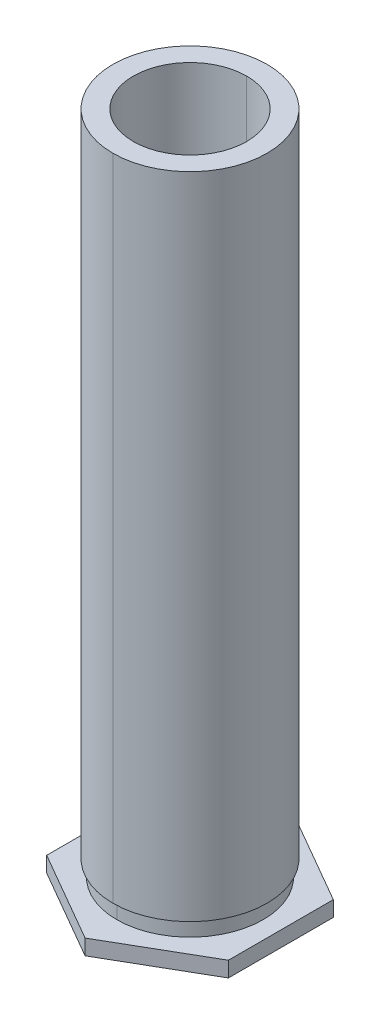
ISO-10303-21;
HEADER;
FILE_DESCRIPTION(('STEP AP214'),'2;1');
FILE_NAME('part.step','',(''),(''),'','','');
FILE_SCHEMA(('AUTOMOTIVE_DESIGN { 1 0 10303 214 1 1 1 1 }'));
ENDSEC;
DATA;
#1=APPLICATION_CONTEXT('core data for automotive mechanical design processes');
#2=APPLICATION_PROTOCOL_DEFINITION('international standard','automotive_design',2000,#1);
#3=PRODUCT_CONTEXT('',#1,'mechanical');
#4=PRODUCT('Part','Part','',(#3));
#5=PRODUCT_RELATED_PRODUCT_CATEGORY('part','',(#4));
#6=PRODUCT_DEFINITION_FORMATION('','',#4);
#7=PRODUCT_DEFINITION_CONTEXT('part definition',#1,'design');
#8=PRODUCT_DEFINITION('design','',#6,#7);
#9=PRODUCT_DEFINITION_SHAPE('','',#8);
#10=(LENGTH_UNIT() NAMED_UNIT(*) SI_UNIT(.MILLI.,.METRE.));
#11=(NAMED_UNIT(*) PLANE_ANGLE_UNIT() SI_UNIT($,.RADIAN.));
#12=(NAMED_UNIT(*) SI_UNIT($,.STERADIAN.) SOLID_ANGLE_UNIT());
#13=UNCERTAINTY_MEASURE_WITH_UNIT(LENGTH_MEASURE(1.E-05),#10,'distance_accuracy_value','');
#14=(GEOMETRIC_REPRESENTATION_CONTEXT(3) GLOBAL_UNCERTAINTY_ASSIGNED_CONTEXT((#13)) GLOBAL_UNIT_ASSIGNED_CONTEXT((#10,
#11,#12)) REPRESENTATION_CONTEXT('',''));
#15=CARTESIAN_POINT('',(0.,0.,0.));
#16=DIRECTION('',(0.,0.,1.));
#17=DIRECTION('',(1.,0.,0.));
#18=AXIS2_PLACEMENT_3D('',#15,#16,#17);
#19=CARTESIAN_POINT('',(3.175,0.,-1.83308710467706));
#20=DIRECTION('',(1.,0.,0.));
#21=DIRECTION('',(0.,1.,0.));
#22=AXIS2_PLACEMENT_3D('',#19,#20,#21);
#23=PLANE('',#22);
#24=DIRECTION('',(0.,0.,-1.));
#25=VECTOR('',#24,1.);
#26=CARTESIAN_POINT('',(3.175,0.53848,-1.83308710467706));
#27=LINE('',#26,#25);
#28=CARTESIAN_POINT('',(3.175,0.53848,1.83308710467706));
#29=VERTEX_POINT('',#28);
#30=CARTESIAN_POINT('',(3.175,0.53848,-1.83308710467706));
#31=VERTEX_POINT('',#30);
#32=EDGE_CURVE('E388',#29,#31,#27,.T.);
#33=ORIENTED_EDGE('',*,*,#32,.F.);
#34=DIRECTION('',(0.,1.,0.));
#35=VECTOR('',#34,1.);
#36=CARTESIAN_POINT('',(3.175,0.,1.83308710467706));
#37=LINE('',#36,#35);
#38=CARTESIAN_POINT('',(3.175,0.,1.83308710467706));
#39=VERTEX_POINT('',#38);
#40=EDGE_CURVE('E336',#39,#29,#37,.T.);
#41=ORIENTED_EDGE('',*,*,#40,.F.);
#42=DIRECTION('',(0.,0.,-1.));
#43=VECTOR('',#42,1.);
#44=CARTESIAN_POINT('',(3.175,0.,-1.83308710467706));
#45=LINE('',#44,#43);
#46=CARTESIAN_POINT('',(3.175,0.,-1.83308710467706));
#47=VERTEX_POINT('',#46);
#48=EDGE_CURVE('E261',#39,#47,#45,.T.);
#49=ORIENTED_EDGE('',*,*,#48,.T.);
#50=DIRECTION('',(0.,1.,0.));
#51=VECTOR('',#50,1.);
#52=CARTESIAN_POINT('',(3.175,0.,-1.83308710467706));
#53=LINE('',#52,#51);
#54=EDGE_CURVE('E11',#47,#31,#53,.T.);
#55=ORIENTED_EDGE('',*,*,#54,.T.);
#56=EDGE_LOOP('',(#33,#41,#49,#55));
#57=FACE_BOUND('',#56,.T.);
#58=ADVANCED_FACE('F17',(#57),#23,.T.);
#59=CARTESIAN_POINT('',(0.,0.,-3.66617420935412));
#60=DIRECTION('',(0.5,0.,-0.866025403784439));
#61=DIRECTION('',(0.,-1.,0.));
#62=AXIS2_PLACEMENT_3D('',#59,#60,#61);
#63=PLANE('',#62);
#64=DIRECTION('',(-0.866025403784439,0.,-0.5));
#65=VECTOR('',#64,1.);
#66=CARTESIAN_POINT('',(0.,0.53848,-3.66617420935412));
#67=LINE('',#66,#65);
#68=CARTESIAN_POINT('',(0.,0.53848,-3.66617420935412));
#69=VERTEX_POINT('',#68);
#70=EDGE_CURVE('E304',#31,#69,#67,.T.);
#71=ORIENTED_EDGE('',*,*,#70,.F.);
#72=ORIENTED_EDGE('',*,*,#54,.F.);
#73=DIRECTION('',(-0.866025403784439,0.,-0.5));
#74=VECTOR('',#73,1.);
#75=CARTESIAN_POINT('',(0.,0.,-3.66617420935412));
#76=LINE('',#75,#74);
#77=CARTESIAN_POINT('',(0.,0.,-3.66617420935412));
#78=VERTEX_POINT('',#77);
#79=EDGE_CURVE('E238',#47,#78,#76,.T.);
#80=ORIENTED_EDGE('',*,*,#79,.T.);
#81=DIRECTION('',(0.,1.,0.));
#82=VECTOR('',#81,1.);
#83=CARTESIAN_POINT('',(0.,0.,-3.66617420935412));
#84=LINE('',#83,#82);
#85=EDGE_CURVE('E28',#78,#69,#84,.T.);
#86=ORIENTED_EDGE('',*,*,#85,.T.);
#87=EDGE_LOOP('',(#71,#72,#80,#86));
#88=FACE_BOUND('',#87,.T.);
#89=ADVANCED_FACE('F549',(#88),#63,.T.);
#90=CARTESIAN_POINT('',(-3.175,0.,-1.83308710467706));
#91=DIRECTION('',(-0.5,0.,-0.866025403784439));
#92=DIRECTION('',(-0.866025403784439,0.,0.5));
#93=AXIS2_PLACEMENT_3D('',#90,#91,#92);
#94=PLANE('',#93);
#95=DIRECTION('',(-0.866025403784439,0.,0.5));
#96=VECTOR('',#95,1.);
#97=CARTESIAN_POINT('',(-3.175,0.53848,-1.83308710467706));
#98=LINE('',#97,#96);
#99=CARTESIAN_POINT('',(-3.175,0.53848,-1.83308710467706));
#100=VERTEX_POINT('',#99);
#101=EDGE_CURVE('E300',#69,#100,#98,.T.);
#102=ORIENTED_EDGE('',*,*,#101,.F.);
#103=ORIENTED_EDGE('',*,*,#85,.F.);
#104=DIRECTION('',(-0.866025403784439,0.,0.5));
#105=VECTOR('',#104,1.);
#106=CARTESIAN_POINT('',(-3.175,0.,-1.83308710467706));
#107=LINE('',#106,#105);
#108=CARTESIAN_POINT('',(-3.175,0.,-1.83308710467706));
#109=VERTEX_POINT('',#108);
#110=EDGE_CURVE('E241',#78,#109,#107,.T.);
#111=ORIENTED_EDGE('',*,*,#110,.T.);
#112=DIRECTION('',(0.,1.,0.));
#113=VECTOR('',#112,1.);
#114=CARTESIAN_POINT('',(-3.175,0.,-1.83308710467706));
#115=LINE('',#114,#113);
#116=EDGE_CURVE('E280',#109,#100,#115,.T.);
#117=ORIENTED_EDGE('',*,*,#116,.T.);
#118=EDGE_LOOP('',(#102,#103,#111,#117));
#119=FACE_BOUND('',#118,.T.);
#120=ADVANCED_FACE('F555',(#119),#94,.T.);
#121=CARTESIAN_POINT('',(-3.175,0.,1.83308710467706));
#122=DIRECTION('',(-1.,0.,0.));
#123=DIRECTION('',(0.,0.,1.));
#124=AXIS2_PLACEMENT_3D('',#121,#122,#123);
#125=PLANE('',#124);
#126=DIRECTION('',(0.,0.,1.));
#127=VECTOR('',#126,1.);
#128=CARTESIAN_POINT('',(-3.175,0.53848,1.83308710467706));
#129=LINE('',#128,#127);
#130=CARTESIAN_POINT('',(-3.175,0.53848,1.83308710467706));
#131=VERTEX_POINT('',#130);
#132=EDGE_CURVE('E262',#100,#131,#129,.T.);
#133=ORIENTED_EDGE('',*,*,#132,.F.);
#134=ORIENTED_EDGE('',*,*,#116,.F.);
#135=DIRECTION('',(0.,0.,1.));
#136=VECTOR('',#135,1.);
#137=CARTESIAN_POINT('',(-3.175,0.,1.83308710467706));
#138=LINE('',#137,#136);
#139=CARTESIAN_POINT('',(-3.175,0.,1.83308710467706));
#140=VERTEX_POINT('',#139);
#141=EDGE_CURVE('E246',#109,#140,#138,.T.);
#142=ORIENTED_EDGE('',*,*,#141,.T.);
#143=DIRECTION('',(0.,1.,0.));
#144=VECTOR('',#143,1.);
#145=CARTESIAN_POINT('',(-3.175,0.,1.83308710467706));
#146=LINE('',#145,#144);
#147=EDGE_CURVE('E123',#140,#131,#146,.T.);
#148=ORIENTED_EDGE('',*,*,#147,.T.);
#149=EDGE_LOOP('',(#133,#134,#142,#148));
#150=FACE_BOUND('',#149,.T.);
#151=ADVANCED_FACE('F583',(#150),#125,.T.);
#152=CARTESIAN_POINT('',(0.,0.,3.66617420935412));
#153=DIRECTION('',(-0.5,0.,0.866025403784439));
#154=DIRECTION('',(0.,1.,0.));
#155=AXIS2_PLACEMENT_3D('',#152,#153,#154);
#156=PLANE('',#155);
#157=DIRECTION('',(0.866025403784439,0.,0.5));
#158=VECTOR('',#157,1.);
#159=CARTESIAN_POINT('',(0.,0.53848,3.66617420935412));
#160=LINE('',#159,#158);
#161=CARTESIAN_POINT('',(0.,0.53848,3.66617420935412));
#162=VERTEX_POINT('',#161);
#163=EDGE_CURVE('E342',#131,#162,#160,.T.);
#164=ORIENTED_EDGE('',*,*,#163,.F.);
#165=ORIENTED_EDGE('',*,*,#147,.F.);
#166=DIRECTION('',(0.866025403784439,0.,0.5));
#167=VECTOR('',#166,1.);
#168=CARTESIAN_POINT('',(0.,0.,3.66617420935412));
#169=LINE('',#168,#167);
#170=CARTESIAN_POINT('',(0.,0.,3.66617420935412));
#171=VERTEX_POINT('',#170);
#172=EDGE_CURVE('E242',#140,#171,#169,.T.);
#173=ORIENTED_EDGE('',*,*,#172,.T.);
#174=DIRECTION('',(0.,1.,0.));
#175=VECTOR('',#174,1.);
#176=CARTESIAN_POINT('',(0.,0.,3.66617420935412));
#177=LINE('',#176,#175);
#178=EDGE_CURVE('E333',#171,#162,#177,.T.);
#179=ORIENTED_EDGE('',*,*,#178,.T.);
#180=EDGE_LOOP('',(#164,#165,#173,#179));
#181=FACE_BOUND('',#180,.T.);
#182=ADVANCED_FACE('F381',(#181),#156,.T.);
#183=CARTESIAN_POINT('',(3.175,0.,1.83308710467706));
#184=DIRECTION('',(0.5,0.,0.866025403784439));
#185=DIRECTION('',(0.,-1.,0.));
#186=AXIS2_PLACEMENT_3D('',#183,#184,#185);
#187=PLANE('',#186);
#188=DIRECTION('',(0.866025403784439,0.,-0.5));
#189=VECTOR('',#188,1.);
#190=CARTESIAN_POINT('',(3.175,0.53848,1.83308710467706));
#191=LINE('',#190,#189);
#192=EDGE_CURVE('E236',#162,#29,#191,.T.);
#193=ORIENTED_EDGE('',*,*,#192,.F.);
#194=ORIENTED_EDGE('',*,*,#178,.F.);
#195=DIRECTION('',(0.866025403784439,0.,-0.5));
#196=VECTOR('',#195,1.);
#197=CARTESIAN_POINT('',(3.175,0.,1.83308710467706));
#198=LINE('',#197,#196);
#199=EDGE_CURVE('E247',#171,#39,#198,.T.);
#200=ORIENTED_EDGE('',*,*,#199,.T.);
#201=ORIENTED_EDGE('',*,*,#40,.T.);
#202=EDGE_LOOP('',(#193,#194,#200,#201));
#203=FACE_BOUND('',#202,.T.);
#204=ADVANCED_FACE('F385',(#203),#187,.T.);
#205=CARTESIAN_POINT('',(0.,-2.54,0.));
#206=DIRECTION('',(0.,-1.,0.));
#207=DIRECTION('',(0.,0.,-1.));
#208=AXIS2_PLACEMENT_3D('',#205,#206,#207);
#209=CYLINDRICAL_SURFACE('',#208,1.9812);
#210=DIRECTION('',(0.,-1.,0.));
#211=VECTOR('',#210,1.);
#212=CARTESIAN_POINT('',(0.,-2.54,1.9812));
#213=LINE('',#212,#211);
#214=CARTESIAN_POINT('',(0.,23.7998,1.9812));
#215=VERTEX_POINT('',#214);
#216=CARTESIAN_POINT('',(0.,12.7,1.9812));
#217=VERTEX_POINT('',#216);
#218=EDGE_CURVE('E258',#215,#217,#213,.T.);
#219=ORIENTED_EDGE('',*,*,#218,.F.);
#220=CARTESIAN_POINT('',(0.,23.7998,0.));
#221=DIRECTION('',(0.,1.,0.));
#222=DIRECTION('',(0.,0.,1.));
#223=AXIS2_PLACEMENT_3D('',#220,#221,#222);
#224=CIRCLE('',#223,1.9812);
#225=CARTESIAN_POINT('',(0.,23.7998,-1.9812));
#226=VERTEX_POINT('',#225);
#227=EDGE_CURVE('E252',#215,#226,#224,.T.);
#228=ORIENTED_EDGE('',*,*,#227,.T.);
#229=DIRECTION('',(0.,-1.,0.));
#230=VECTOR('',#229,1.);
#231=CARTESIAN_POINT('',(0.,-2.54,-1.9812));
#232=LINE('',#231,#230);
#233=CARTESIAN_POINT('',(0.,12.7,-1.9812));
#234=VERTEX_POINT('',#233);
#235=EDGE_CURVE('E257',#226,#234,#232,.T.);
#236=ORIENTED_EDGE('',*,*,#235,.T.);
#237=CARTESIAN_POINT('',(0.,12.7,0.));
#238=DIRECTION('',(0.,-1.,0.));
#239=DIRECTION('',(0.,0.,-1.));
#240=AXIS2_PLACEMENT_3D('',#237,#238,#239);
#241=CIRCLE('',#240,1.9812);
#242=EDGE_CURVE('E146',#234,#217,#241,.T.);
#243=ORIENTED_EDGE('',*,*,#242,.T.);
#244=EDGE_LOOP('',(#219,#228,#236,#243));
#245=FACE_BOUND('',#244,.T.);
#246=ADVANCED_FACE('F565',(#245),#209,.F.);
#247=CARTESIAN_POINT('',(0.,12.4199860165415,0.));
#248=DIRECTION('',(0.,1.,0.));
#249=DIRECTION('',(0.,0.,1.));
#250=AXIS2_PLACEMENT_3D('',#247,#248,#249);
#251=CONICAL_SURFACE('',#250,1.35255,0.960105621522079);
#252=DIRECTION('',(0.,0.573433458613232,-0.819252139785345));
#253=VECTOR('',#252,1.);
#254=CARTESIAN_POINT('',(0.,12.4199860165415,-1.35255));
#255=LINE('',#254,#253);
#256=CARTESIAN_POINT('',(0.,12.4199860165415,-1.35255));
#257=VERTEX_POINT('',#256);
#258=CARTESIAN_POINT('',(0.,12.7,-1.7526));
#259=VERTEX_POINT('',#258);
#260=EDGE_CURVE('E286',#257,#259,#255,.T.);
#261=ORIENTED_EDGE('',*,*,#260,.F.);
#262=CARTESIAN_POINT('',(0.,12.4199860165415,0.));
#263=DIRECTION('',(0.,-1.,0.));
#264=DIRECTION('',(0.,0.,-1.));
#265=AXIS2_PLACEMENT_3D('',#262,#263,#264);
#266=CIRCLE('',#265,1.35255);
#267=CARTESIAN_POINT('',(0.,12.4199860165415,1.35255));
#268=VERTEX_POINT('',#267);
#269=EDGE_CURVE('E248',#257,#268,#266,.T.);
#270=ORIENTED_EDGE('',*,*,#269,.T.);
#271=DIRECTION('',(0.,0.573433458613232,0.819252139785345));
#272=VECTOR('',#271,1.);
#273=CARTESIAN_POINT('',(0.,12.4199860165415,1.35255));
#274=LINE('',#273,#272);
#275=CARTESIAN_POINT('',(0.,12.7,1.7526));
#276=VERTEX_POINT('',#275);
#277=EDGE_CURVE('E296',#268,#276,#274,.T.);
#278=ORIENTED_EDGE('',*,*,#277,.T.);
#279=CARTESIAN_POINT('',(0.,12.7,0.));
#280=DIRECTION('',(0.,-1.,0.));
#281=DIRECTION('',(0.,0.,-1.));
#282=AXIS2_PLACEMENT_3D('',#279,#280,#281);
#283=CIRCLE('',#282,1.7526);
#284=EDGE_CURVE('E187',#259,#276,#283,.T.);
#285=ORIENTED_EDGE('',*,*,#284,.F.);
#286=EDGE_LOOP('',(#261,#270,#278,#285));
#287=FACE_BOUND('',#286,.T.);
#288=ADVANCED_FACE('F568',(#287),#251,.F.);
#289=CARTESIAN_POINT('',(1.9812,12.7,0.));
#290=DIRECTION('',(0.,-1.,0.));
#291=DIRECTION('',(0.,0.,-1.));
#292=AXIS2_PLACEMENT_3D('',#289,#290,#291);
#293=PLANE('',#292);
#294=CARTESIAN_POINT('',(0.,12.7,0.));
#295=DIRECTION('',(0.,-1.,0.));
#296=DIRECTION('',(0.,0.,-1.));
#297=AXIS2_PLACEMENT_3D('',#294,#295,#296);
#298=CIRCLE('',#297,1.7526);
#299=EDGE_CURVE('E290',#276,#259,#298,.T.);
#300=ORIENTED_EDGE('',*,*,#299,.T.);
#301=ORIENTED_EDGE('',*,*,#284,.T.);
#302=EDGE_LOOP('',(#300,#301));
#303=FACE_BOUND('',#302,.T.);
#304=ORIENTED_EDGE('',*,*,#242,.F.);
#305=CARTESIAN_POINT('',(0.,12.7,0.));
#306=DIRECTION('',(0.,-1.,0.));
#307=DIRECTION('',(0.,0.,-1.));
#308=AXIS2_PLACEMENT_3D('',#305,#306,#307);
#309=CIRCLE('',#308,1.9812);
#310=EDGE_CURVE('E253',#217,#234,#309,.T.);
#311=ORIENTED_EDGE('',*,*,#310,.F.);
#312=EDGE_LOOP('',(#304,#311));
#313=FACE_BOUND('',#312,.T.);
#314=ADVANCED_FACE('F544',(#303,#313),#293,.F.);
#315=CARTESIAN_POINT('',(0.,0.,0.));
#316=DIRECTION('',(0.,-1.,0.));
#317=DIRECTION('',(0.,0.,-1.));
#318=AXIS2_PLACEMENT_3D('',#315,#316,#317);
#319=CYLINDRICAL_SURFACE('',#318,2.6924);
#320=DIRECTION('',(0.,-1.,0.));
#321=VECTOR('',#320,1.);
#322=CARTESIAN_POINT('',(0.,0.,2.6924));
#323=LINE('',#322,#321);
#324=CARTESIAN_POINT('',(0.,0.00254000000000007,2.6924));
#325=VERTEX_POINT('',#324);
#326=CARTESIAN_POINT('',(0.,0.,2.6924));
#327=VERTEX_POINT('',#326);
#328=EDGE_CURVE('E278',#325,#327,#323,.T.);
#329=ORIENTED_EDGE('',*,*,#328,.F.);
#330=CARTESIAN_POINT('',(0.,0.00254000000000007,0.));
#331=DIRECTION('',(0.,-1.,0.));
#332=DIRECTION('',(0.,0.,-1.));
#333=AXIS2_PLACEMENT_3D('',#330,#331,#332);
#334=CIRCLE('',#333,2.6924);
#335=CARTESIAN_POINT('',(0.,0.00254000000000007,-2.6924));
#336=VERTEX_POINT('',#335);
#337=EDGE_CURVE('E297',#336,#325,#334,.T.);
#338=ORIENTED_EDGE('',*,*,#337,.F.);
#339=DIRECTION('',(0.,-1.,0.));
#340=VECTOR('',#339,1.);
#341=CARTESIAN_POINT('',(0.,0.,-2.6924));
#342=LINE('',#341,#340);
#343=CARTESIAN_POINT('',(0.,0.,-2.6924));
#344=VERTEX_POINT('',#343);
#345=EDGE_CURVE('E271',#336,#344,#342,.T.);
#346=ORIENTED_EDGE('',*,*,#345,.T.);
#347=CARTESIAN_POINT('',(0.,0.,0.));
#348=DIRECTION('',(0.,-1.,0.));
#349=DIRECTION('',(0.,0.,-1.));
#350=AXIS2_PLACEMENT_3D('',#347,#348,#349);
#351=CIRCLE('',#350,2.6924);
#352=EDGE_CURVE('E212',#344,#327,#351,.T.);
#353=ORIENTED_EDGE('',*,*,#352,.T.);
#354=EDGE_LOOP('',(#329,#338,#346,#353));
#355=FACE_BOUND('',#354,.T.);
#356=ADVANCED_FACE('F530',(#355),#319,.F.);
#357=CARTESIAN_POINT('',(2.6924,0.00253999999999981,0.));
#358=DIRECTION('',(0.,-1.,0.));
#359=DIRECTION('',(0.,0.,-1.));
#360=AXIS2_PLACEMENT_3D('',#357,#358,#359);
#361=PLANE('',#360);
#362=CARTESIAN_POINT('',(0.,0.00253999999999981,0.));
#363=DIRECTION('',(0.,-1.,0.));
#364=DIRECTION('',(0.,0.,-1.));
#365=AXIS2_PLACEMENT_3D('',#362,#363,#364);
#366=CIRCLE('',#365,1.35255);
#367=CARTESIAN_POINT('',(0.,0.00253999999999981,-1.35255));
#368=VERTEX_POINT('',#367);
#369=CARTESIAN_POINT('',(0.,0.00253999999999981,1.35255));
#370=VERTEX_POINT('',#369);
#371=EDGE_CURVE('E251',#368,#370,#366,.T.);
#372=ORIENTED_EDGE('',*,*,#371,.F.);
#373=CARTESIAN_POINT('',(0.,0.00253999999999981,0.));
#374=DIRECTION('',(0.,-1.,0.));
#375=DIRECTION('',(0.,0.,-1.));
#376=AXIS2_PLACEMENT_3D('',#373,#374,#375);
#377=CIRCLE('',#376,1.35255);
#378=EDGE_CURVE('E270',#370,#368,#377,.T.);
#379=ORIENTED_EDGE('',*,*,#378,.F.);
#380=EDGE_LOOP('',(#372,#379));
#381=FACE_BOUND('',#380,.T.);
#382=ORIENTED_EDGE('',*,*,#337,.T.);
#383=CARTESIAN_POINT('',(0.,0.00254000000000007,0.));
#384=DIRECTION('',(0.,-1.,0.));
#385=DIRECTION('',(0.,0.,-1.));
#386=AXIS2_PLACEMENT_3D('',#383,#384,#385);
#387=CIRCLE('',#386,2.6924);
#388=EDGE_CURVE('E292',#325,#336,#387,.T.);
#389=ORIENTED_EDGE('',*,*,#388,.T.);
#390=EDGE_LOOP('',(#382,#389));
#391=FACE_BOUND('',#390,.T.);
#392=ADVANCED_FACE('F420',(#381,#391),#361,.T.);
#393=CARTESIAN_POINT('',(0.,0.,0.));
#394=DIRECTION('',(0.,-1.,0.));
#395=DIRECTION('',(0.,0.,-1.));
#396=AXIS2_PLACEMENT_3D('',#393,#394,#395);
#397=CYLINDRICAL_SURFACE('',#396,1.35255);
#398=DIRECTION('',(0.,-1.,0.));
#399=VECTOR('',#398,1.);
#400=CARTESIAN_POINT('',(0.,0.,1.35255));
#401=LINE('',#400,#399);
#402=EDGE_CURVE('E266',#268,#370,#401,.T.);
#403=ORIENTED_EDGE('',*,*,#402,.F.);
#404=ORIENTED_EDGE('',*,*,#269,.F.);
#405=DIRECTION('',(0.,-1.,0.));
#406=VECTOR('',#405,1.);
#407=CARTESIAN_POINT('',(0.,0.,-1.35255));
#408=LINE('',#407,#406);
#409=EDGE_CURVE('E285',#257,#368,#408,.T.);
#410=ORIENTED_EDGE('',*,*,#409,.T.);
#411=ORIENTED_EDGE('',*,*,#371,.T.);
#412=EDGE_LOOP('',(#403,#404,#410,#411));
#413=FACE_BOUND('',#412,.T.);
#414=ADVANCED_FACE('F414',(#413),#397,.F.);
#415=CARTESIAN_POINT('',(2.6924,23.7998,0.));
#416=DIRECTION('',(0.,1.,0.));
#417=DIRECTION('',(1.,0.,0.));
#418=AXIS2_PLACEMENT_3D('',#415,#416,#417);
#419=PLANE('',#418);
#420=CARTESIAN_POINT('',(0.,23.7998,0.));
#421=DIRECTION('',(0.,1.,0.));
#422=DIRECTION('',(0.,0.,1.));
#423=AXIS2_PLACEMENT_3D('',#420,#421,#422);
#424=CIRCLE('',#423,1.9812);
#425=EDGE_CURVE('E308',#226,#215,#424,.T.);
#426=ORIENTED_EDGE('',*,*,#425,.F.);
#427=ORIENTED_EDGE('',*,*,#227,.F.);
#428=EDGE_LOOP('',(#426,#427));
#429=FACE_BOUND('',#428,.T.);
#430=CARTESIAN_POINT('',(0.,23.7998,0.));
#431=DIRECTION('',(0.,-1.,0.));
#432=DIRECTION('',(0.,0.,-1.));
#433=AXIS2_PLACEMENT_3D('',#430,#431,#432);
#434=CIRCLE('',#433,2.6924);
#435=CARTESIAN_POINT('',(0.,23.7998,-2.6924));
#436=VERTEX_POINT('',#435);
#437=CARTESIAN_POINT('',(0.,23.7998,2.6924));
#438=VERTEX_POINT('',#437);
#439=EDGE_CURVE('E309',#436,#438,#434,.T.);
#440=ORIENTED_EDGE('',*,*,#439,.F.);
#441=CARTESIAN_POINT('',(0.,23.7998,0.));
#442=DIRECTION('',(0.,-1.,0.));
#443=DIRECTION('',(0.,0.,-1.));
#444=AXIS2_PLACEMENT_3D('',#441,#442,#443);
#445=CIRCLE('',#444,2.6924);
#446=EDGE_CURVE('E21',#438,#436,#445,.T.);
#447=ORIENTED_EDGE('',*,*,#446,.F.);
#448=EDGE_LOOP('',(#440,#447));
#449=FACE_BOUND('',#448,.T.);
#450=ADVANCED_FACE('F542',(#429,#449),#419,.T.);
#451=CARTESIAN_POINT('',(0.,0.,0.));
#452=DIRECTION('',(0.,-1.,0.));
#453=DIRECTION('',(0.,0.,-1.));
#454=AXIS2_PLACEMENT_3D('',#451,#452,#453);
#455=CYLINDRICAL_SURFACE('',#454,2.6924);
#456=DIRECTION('',(0.,-1.,0.));
#457=VECTOR('',#456,1.);
#458=CARTESIAN_POINT('',(0.,0.,2.6924));
#459=LINE('',#458,#457);
#460=CARTESIAN_POINT('',(0.,1.103884,2.6924));
#461=VERTEX_POINT('',#460);
#462=EDGE_CURVE('E313',#438,#461,#459,.T.);
#463=ORIENTED_EDGE('',*,*,#462,.F.);
#464=ORIENTED_EDGE('',*,*,#446,.T.);
#465=DIRECTION('',(0.,-1.,0.));
#466=VECTOR('',#465,1.);
#467=CARTESIAN_POINT('',(0.,0.,-2.6924));
#468=LINE('',#467,#466);
#469=CARTESIAN_POINT('',(0.,1.103884,-2.6924));
#470=VERTEX_POINT('',#469);
#471=EDGE_CURVE('E225',#436,#470,#468,.T.);
#472=ORIENTED_EDGE('',*,*,#471,.T.);
#473=CARTESIAN_POINT('',(0.,1.103884,0.));
#474=DIRECTION('',(0.,-1.,0.));
#475=DIRECTION('',(0.,0.,-1.));
#476=AXIS2_PLACEMENT_3D('',#473,#474,#475);
#477=CIRCLE('',#476,2.6924);
#478=EDGE_CURVE('E211',#461,#470,#477,.T.);
#479=ORIENTED_EDGE('',*,*,#478,.F.);
#480=EDGE_LOOP('',(#463,#464,#472,#479));
#481=FACE_BOUND('',#480,.T.);
#482=ADVANCED_FACE('F563',(#481),#455,.T.);
#483=CARTESIAN_POINT('',(2.6924,1.103884,0.));
#484=DIRECTION('',(0.,-1.,0.));
#485=DIRECTION('',(0.,0.,-1.));
#486=AXIS2_PLACEMENT_3D('',#483,#484,#485);
#487=PLANE('',#486);
#488=CARTESIAN_POINT('',(0.,1.103884,0.));
#489=DIRECTION('',(0.,-1.,0.));
#490=DIRECTION('',(0.,0.,-1.));
#491=AXIS2_PLACEMENT_3D('',#488,#489,#490);
#492=CIRCLE('',#491,2.55778);
#493=CARTESIAN_POINT('',(0.,1.103884,-2.55778));
#494=VERTEX_POINT('',#493);
#495=CARTESIAN_POINT('',(0.,1.103884,2.55778));
#496=VERTEX_POINT('',#495);
#497=EDGE_CURVE('E207',#494,#496,#492,.T.);
#498=ORIENTED_EDGE('',*,*,#497,.F.);
#499=CARTESIAN_POINT('',(0.,1.103884,0.));
#500=DIRECTION('',(0.,-1.,0.));
#501=DIRECTION('',(0.,0.,-1.));
#502=AXIS2_PLACEMENT_3D('',#499,#500,#501);
#503=CIRCLE('',#502,2.55778);
#504=EDGE_CURVE('E202',#496,#494,#503,.T.);
#505=ORIENTED_EDGE('',*,*,#504,.F.);
#506=EDGE_LOOP('',(#498,#505));
#507=FACE_BOUND('',#506,.T.);
#508=CARTESIAN_POINT('',(0.,1.103884,0.));
#509=DIRECTION('',(0.,-1.,0.));
#510=DIRECTION('',(0.,0.,-1.));
#511=AXIS2_PLACEMENT_3D('',#508,#509,#510);
#512=CIRCLE('',#511,2.6924);
#513=EDGE_CURVE('E232',#470,#461,#512,.T.);
#514=ORIENTED_EDGE('',*,*,#513,.T.);
#515=ORIENTED_EDGE('',*,*,#478,.T.);
#516=EDGE_LOOP('',(#514,#515));
#517=FACE_BOUND('',#516,.T.);
#518=ADVANCED_FACE('F204',(#507,#517),#487,.T.);
#519=CARTESIAN_POINT('',(0.,0.,0.));
#520=DIRECTION('',(0.,-1.,0.));
#521=DIRECTION('',(0.,0.,-1.));
#522=AXIS2_PLACEMENT_3D('',#519,#520,#521);
#523=CYLINDRICAL_SURFACE('',#522,2.55778);
#524=DIRECTION('',(0.,-1.,0.));
#525=VECTOR('',#524,1.);
#526=CARTESIAN_POINT('',(0.,0.,2.55778));
#527=LINE('',#526,#525);
#528=CARTESIAN_POINT('',(0.,0.53848,2.55778));
#529=VERTEX_POINT('',#528);
#530=EDGE_CURVE('E215',#496,#529,#527,.T.);
#531=ORIENTED_EDGE('',*,*,#530,.F.);
#532=ORIENTED_EDGE('',*,*,#504,.T.);
#533=DIRECTION('',(0.,-1.,0.));
#534=VECTOR('',#533,1.);
#535=CARTESIAN_POINT('',(0.,0.,-2.55778));
#536=LINE('',#535,#534);
#537=CARTESIAN_POINT('',(0.,0.53848,-2.55778));
#538=VERTEX_POINT('',#537);
#539=EDGE_CURVE('E223',#494,#538,#536,.T.);
#540=ORIENTED_EDGE('',*,*,#539,.T.);
#541=CARTESIAN_POINT('',(0.,0.53848,0.));
#542=DIRECTION('',(0.,-1.,0.));
#543=DIRECTION('',(0.,0.,-1.));
#544=AXIS2_PLACEMENT_3D('',#541,#542,#543);
#545=CIRCLE('',#544,2.55778);
#546=EDGE_CURVE('E134',#529,#538,#545,.T.);
#547=ORIENTED_EDGE('',*,*,#546,.F.);
#548=EDGE_LOOP('',(#531,#532,#540,#547));
#549=FACE_BOUND('',#548,.T.);
#550=ADVANCED_FACE('F216',(#549),#523,.T.);
#551=CARTESIAN_POINT('',(2.6924,0.,0.));
#552=DIRECTION('',(0.,-1.,0.));
#553=DIRECTION('',(0.,0.,-1.));
#554=AXIS2_PLACEMENT_3D('',#551,#552,#553);
#555=PLANE('',#554);
#556=ORIENTED_EDGE('',*,*,#352,.F.);
#557=CARTESIAN_POINT('',(0.,0.,0.));
#558=DIRECTION('',(0.,-1.,0.));
#559=DIRECTION('',(0.,0.,-1.));
#560=AXIS2_PLACEMENT_3D('',#557,#558,#559);
#561=CIRCLE('',#560,2.6924);
#562=EDGE_CURVE('E274',#327,#344,#561,.T.);
#563=ORIENTED_EDGE('',*,*,#562,.F.);
#564=EDGE_LOOP('',(#556,#563));
#565=FACE_BOUND('',#564,.T.);
#566=ORIENTED_EDGE('',*,*,#48,.F.);
#567=ORIENTED_EDGE('',*,*,#199,.F.);
#568=ORIENTED_EDGE('',*,*,#172,.F.);
#569=ORIENTED_EDGE('',*,*,#141,.F.);
#570=ORIENTED_EDGE('',*,*,#110,.F.);
#571=ORIENTED_EDGE('',*,*,#79,.F.);
#572=EDGE_LOOP('',(#566,#567,#568,#569,#570,#571));
#573=FACE_BOUND('',#572,.T.);
#574=ADVANCED_FACE('F374',(#565,#573),#555,.T.);
#575=CARTESIAN_POINT('',(3.683,0.53848,0.));
#576=DIRECTION('',(0.,1.,0.));
#577=DIRECTION('',(1.,0.,0.));
#578=AXIS2_PLACEMENT_3D('',#575,#576,#577);
#579=PLANE('',#578);
#580=CARTESIAN_POINT('',(0.,0.53848,0.));
#581=DIRECTION('',(0.,-1.,0.));
#582=DIRECTION('',(0.,0.,-1.));
#583=AXIS2_PLACEMENT_3D('',#580,#581,#582);
#584=CIRCLE('',#583,2.55778);
#585=EDGE_CURVE('E220',#538,#529,#584,.T.);
#586=ORIENTED_EDGE('',*,*,#585,.T.);
#587=ORIENTED_EDGE('',*,*,#546,.T.);
#588=EDGE_LOOP('',(#586,#587));
#589=FACE_BOUND('',#588,.T.);
#590=ORIENTED_EDGE('',*,*,#163,.T.);
#591=ORIENTED_EDGE('',*,*,#192,.T.);
#592=ORIENTED_EDGE('',*,*,#32,.T.);
#593=ORIENTED_EDGE('',*,*,#70,.T.);
#594=ORIENTED_EDGE('',*,*,#101,.T.);
#595=ORIENTED_EDGE('',*,*,#132,.T.);
#596=EDGE_LOOP('',(#590,#591,#592,#593,#594,#595));
#597=FACE_BOUND('',#596,.T.);
#598=ADVANCED_FACE('F371',(#589,#597),#579,.T.);
#599=CARTESIAN_POINT('',(0.,0.,0.));
#600=DIRECTION('',(0.,-1.,0.));
#601=DIRECTION('',(0.,0.,-1.));
#602=AXIS2_PLACEMENT_3D('',#599,#600,#601);
#603=CYLINDRICAL_SURFACE('',#602,2.55778);
#604=ORIENTED_EDGE('',*,*,#497,.T.);
#605=ORIENTED_EDGE('',*,*,#530,.T.);
#606=ORIENTED_EDGE('',*,*,#585,.F.);
#607=ORIENTED_EDGE('',*,*,#539,.F.);
#608=EDGE_LOOP('',(#604,#605,#606,#607));
#609=FACE_BOUND('',#608,.T.);
#610=ADVANCED_FACE('F222',(#609),#603,.T.);
#611=CARTESIAN_POINT('',(0.,0.,0.));
#612=DIRECTION('',(0.,-1.,0.));
#613=DIRECTION('',(0.,0.,-1.));
#614=AXIS2_PLACEMENT_3D('',#611,#612,#613);
#615=CYLINDRICAL_SURFACE('',#614,2.6924);
#616=ORIENTED_EDGE('',*,*,#439,.T.);
#617=ORIENTED_EDGE('',*,*,#462,.T.);
#618=ORIENTED_EDGE('',*,*,#513,.F.);
#619=ORIENTED_EDGE('',*,*,#471,.F.);
#620=EDGE_LOOP('',(#616,#617,#618,#619));
#621=FACE_BOUND('',#620,.T.);
#622=ADVANCED_FACE('F599',(#621),#615,.T.);
#623=CARTESIAN_POINT('',(0.,0.,0.));
#624=DIRECTION('',(0.,-1.,0.));
#625=DIRECTION('',(0.,0.,-1.));
#626=AXIS2_PLACEMENT_3D('',#623,#624,#625);
#627=CYLINDRICAL_SURFACE('',#626,1.35255);
#628=CARTESIAN_POINT('',(0.,12.4199860165415,0.));
#629=DIRECTION('',(0.,-1.,0.));
#630=DIRECTION('',(0.,0.,-1.));
#631=AXIS2_PLACEMENT_3D('',#628,#629,#630);
#632=CIRCLE('',#631,1.35255);
#633=EDGE_CURVE('E291',#268,#257,#632,.T.);
#634=ORIENTED_EDGE('',*,*,#633,.F.);
#635=ORIENTED_EDGE('',*,*,#402,.T.);
#636=ORIENTED_EDGE('',*,*,#378,.T.);
#637=ORIENTED_EDGE('',*,*,#409,.F.);
#638=EDGE_LOOP('',(#634,#635,#636,#637));
#639=FACE_BOUND('',#638,.T.);
#640=ADVANCED_FACE('F418',(#639),#627,.F.);
#641=CARTESIAN_POINT('',(0.,0.,0.));
#642=DIRECTION('',(0.,-1.,0.));
#643=DIRECTION('',(0.,0.,-1.));
#644=AXIS2_PLACEMENT_3D('',#641,#642,#643);
#645=CYLINDRICAL_SURFACE('',#644,2.6924);
#646=ORIENTED_EDGE('',*,*,#388,.F.);
#647=ORIENTED_EDGE('',*,*,#328,.T.);
#648=ORIENTED_EDGE('',*,*,#562,.T.);
#649=ORIENTED_EDGE('',*,*,#345,.F.);
#650=EDGE_LOOP('',(#646,#647,#648,#649));
#651=FACE_BOUND('',#650,.T.);
#652=ADVANCED_FACE('F533',(#651),#645,.F.);
#653=CARTESIAN_POINT('',(0.,12.4199860165415,0.));
#654=DIRECTION('',(0.,1.,0.));
#655=DIRECTION('',(0.,0.,1.));
#656=AXIS2_PLACEMENT_3D('',#653,#654,#655);
#657=CONICAL_SURFACE('',#656,1.35255,0.960105621522079);
#658=ORIENTED_EDGE('',*,*,#633,.T.);
#659=ORIENTED_EDGE('',*,*,#260,.T.);
#660=ORIENTED_EDGE('',*,*,#299,.F.);
#661=ORIENTED_EDGE('',*,*,#277,.F.);
#662=EDGE_LOOP('',(#658,#659,#660,#661));
#663=FACE_BOUND('',#662,.T.);
#664=ADVANCED_FACE('F592',(#663),#657,.F.);
#665=CARTESIAN_POINT('',(0.,-2.54,0.));
#666=DIRECTION('',(0.,-1.,0.));
#667=DIRECTION('',(0.,0.,-1.));
#668=AXIS2_PLACEMENT_3D('',#665,#666,#667);
#669=CYLINDRICAL_SURFACE('',#668,1.9812);
#670=ORIENTED_EDGE('',*,*,#425,.T.);
#671=ORIENTED_EDGE('',*,*,#218,.T.);
#672=ORIENTED_EDGE('',*,*,#310,.T.);
#673=ORIENTED_EDGE('',*,*,#235,.F.);
#674=EDGE_LOOP('',(#670,#671,#672,#673));
#675=FACE_BOUND('',#674,.T.);
#676=ADVANCED_FACE('F19',(#675),#669,.F.);
#677=CLOSED_SHELL('',(#58,#89,#120,#151,#182,#204,#246,#288,#314,#356,#392,#414,#450,#482,#518,
#550,#574,#598,#610,#622,#640,#652,#664,#676));
#678=MANIFOLD_SOLID_BREP('B1',#677);
#679=ADVANCED_BREP_SHAPE_REPRESENTATION('',(#18,#678),#14);
#680=SHAPE_DEFINITION_REPRESENTATION(#9,#679);
ENDSEC;
END-ISO-10303-21;
